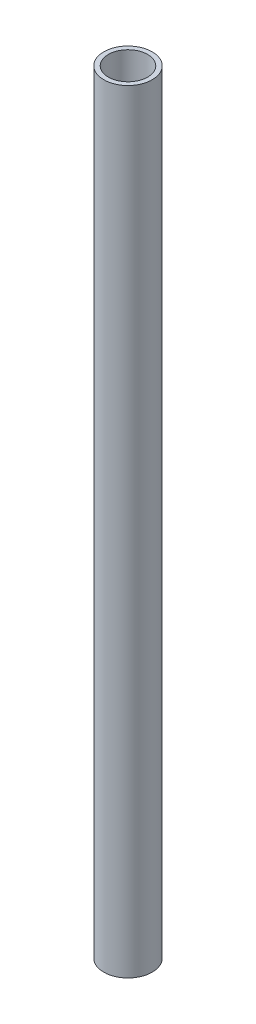
ISO-10303-21;
HEADER;
FILE_DESCRIPTION(('STEP AP214'),'2;1');
FILE_NAME('part.step','',(''),(''),'','','');
FILE_SCHEMA(('AUTOMOTIVE_DESIGN { 1 0 10303 214 1 1 1 1 }'));
ENDSEC;
DATA;
#1=APPLICATION_CONTEXT('core data for automotive mechanical design processes');
#2=APPLICATION_PROTOCOL_DEFINITION('international standard','automotive_design',2000,#1);
#3=PRODUCT_CONTEXT('',#1,'mechanical');
#4=PRODUCT('Part','Part','',(#3));
#5=PRODUCT_RELATED_PRODUCT_CATEGORY('part','',(#4));
#6=PRODUCT_DEFINITION_FORMATION('','',#4);
#7=PRODUCT_DEFINITION_CONTEXT('part definition',#1,'design');
#8=PRODUCT_DEFINITION('design','',#6,#7);
#9=PRODUCT_DEFINITION_SHAPE('','',#8);
#10=(LENGTH_UNIT() NAMED_UNIT(*) SI_UNIT(.MILLI.,.METRE.));
#11=(NAMED_UNIT(*) PLANE_ANGLE_UNIT() SI_UNIT($,.RADIAN.));
#12=(NAMED_UNIT(*) SI_UNIT($,.STERADIAN.) SOLID_ANGLE_UNIT());
#13=UNCERTAINTY_MEASURE_WITH_UNIT(LENGTH_MEASURE(1.E-05),#10,'distance_accuracy_value','');
#14=(GEOMETRIC_REPRESENTATION_CONTEXT(3) GLOBAL_UNCERTAINTY_ASSIGNED_CONTEXT((#13)) GLOBAL_UNIT_ASSIGNED_CONTEXT((#10,
#11,#12)) REPRESENTATION_CONTEXT('',''));
#15=CARTESIAN_POINT('',(0.,0.,0.));
#16=DIRECTION('',(0.,0.,1.));
#17=DIRECTION('',(1.,0.,0.));
#18=AXIS2_PLACEMENT_3D('',#15,#16,#17);
#19=CARTESIAN_POINT('',(2.45914399954472E-11,340.,1.49999999999998));
#20=DIRECTION('',(0.,1.,0.));
#21=DIRECTION('',(0.,0.,1.));
#22=AXIS2_PLACEMENT_3D('',#19,#20,#21);
#23=PLANE('',#22);
#24=CARTESIAN_POINT('',(2.45914399954472E-11,340.,1.49999999999998));
#25=DIRECTION('',(0.,1.,0.));
#26=DIRECTION('',(0.,0.,1.));
#27=AXIS2_PLACEMENT_3D('',#24,#25,#26);
#28=CIRCLE('',#27,10.65);
#29=CARTESIAN_POINT('',(2.45914399954472E-11,340.,12.15));
#30=VERTEX_POINT('',#29);
#31=EDGE_CURVE('E10',#30,#30,#28,.T.);
#32=ORIENTED_EDGE('',*,*,#31,.T.);
#33=EDGE_LOOP('',(#32));
#34=FACE_BOUND('',#33,.T.);
#35=CARTESIAN_POINT('',(2.45914399954472E-11,340.,1.49999999999998));
#36=DIRECTION('',(0.,1.,0.));
#37=DIRECTION('',(0.,0.,1.));
#38=AXIS2_PLACEMENT_3D('',#35,#36,#37);
#39=CIRCLE('',#38,8.65);
#40=CARTESIAN_POINT('',(2.45914399954472E-11,340.,10.15));
#41=VERTEX_POINT('',#40);
#42=EDGE_CURVE('E44',#41,#41,#39,.T.);
#43=ORIENTED_EDGE('',*,*,#42,.F.);
#44=EDGE_LOOP('',(#43));
#45=FACE_BOUND('',#44,.T.);
#46=ADVANCED_FACE('F33',(#34,#45),#23,.T.);
#47=CARTESIAN_POINT('',(2.45914399954472E-11,0.,1.49999999999998));
#48=DIRECTION('',(0.,1.,0.));
#49=DIRECTION('',(0.,0.,1.));
#50=AXIS2_PLACEMENT_3D('',#47,#48,#49);
#51=PLANE('',#50);
#52=CARTESIAN_POINT('',(2.45914399954472E-11,0.,1.49999999999998));
#53=DIRECTION('',(0.,1.,0.));
#54=DIRECTION('',(0.,0.,1.));
#55=AXIS2_PLACEMENT_3D('',#52,#53,#54);
#56=CIRCLE('',#55,10.65);
#57=CARTESIAN_POINT('',(2.45914399954472E-11,0.,12.15));
#58=VERTEX_POINT('',#57);
#59=EDGE_CURVE('E37',#58,#58,#56,.T.);
#60=ORIENTED_EDGE('',*,*,#59,.F.);
#61=EDGE_LOOP('',(#60));
#62=FACE_BOUND('',#61,.T.);
#63=CARTESIAN_POINT('',(2.45914399954472E-11,0.,1.49999999999998));
#64=DIRECTION('',(0.,1.,0.));
#65=DIRECTION('',(0.,0.,1.));
#66=AXIS2_PLACEMENT_3D('',#63,#64,#65);
#67=CIRCLE('',#66,8.65);
#68=CARTESIAN_POINT('',(2.45914399954472E-11,0.,10.15));
#69=VERTEX_POINT('',#68);
#70=EDGE_CURVE('E46',#69,#69,#67,.T.);
#71=ORIENTED_EDGE('',*,*,#70,.T.);
#72=EDGE_LOOP('',(#71));
#73=FACE_BOUND('',#72,.T.);
#74=ADVANCED_FACE('F56',(#62,#73),#51,.F.);
#75=CARTESIAN_POINT('',(2.45914399954472E-11,340.,1.49999999999998));
#76=DIRECTION('',(0.,-1.,0.));
#77=DIRECTION('',(0.,0.,-1.));
#78=AXIS2_PLACEMENT_3D('',#75,#76,#77);
#79=CYLINDRICAL_SURFACE('',#78,10.65);
#80=ORIENTED_EDGE('',*,*,#31,.F.);
#81=EDGE_LOOP('',(#80));
#82=FACE_BOUND('',#81,.T.);
#83=ORIENTED_EDGE('',*,*,#59,.T.);
#84=EDGE_LOOP('',(#83));
#85=FACE_BOUND('',#84,.T.);
#86=ADVANCED_FACE('F35',(#82,#85),#79,.T.);
#87=CARTESIAN_POINT('',(2.45914399954472E-11,340.,1.49999999999998));
#88=DIRECTION('',(0.,-1.,0.));
#89=DIRECTION('',(0.,0.,-1.));
#90=AXIS2_PLACEMENT_3D('',#87,#88,#89);
#91=CYLINDRICAL_SURFACE('',#90,8.65);
#92=ORIENTED_EDGE('',*,*,#42,.T.);
#93=EDGE_LOOP('',(#92));
#94=FACE_BOUND('',#93,.T.);
#95=ORIENTED_EDGE('',*,*,#70,.F.);
#96=EDGE_LOOP('',(#95));
#97=FACE_BOUND('',#96,.T.);
#98=ADVANCED_FACE('F52',(#94,#97),#91,.F.);
#99=CLOSED_SHELL('',(#46,#74,#86,#98));
#100=MANIFOLD_SOLID_BREP('B2',#99);
#101=ADVANCED_BREP_SHAPE_REPRESENTATION('',(#18,#100),#14);
#102=SHAPE_DEFINITION_REPRESENTATION(#9,#101);
ENDSEC;
END-ISO-10303-21;
